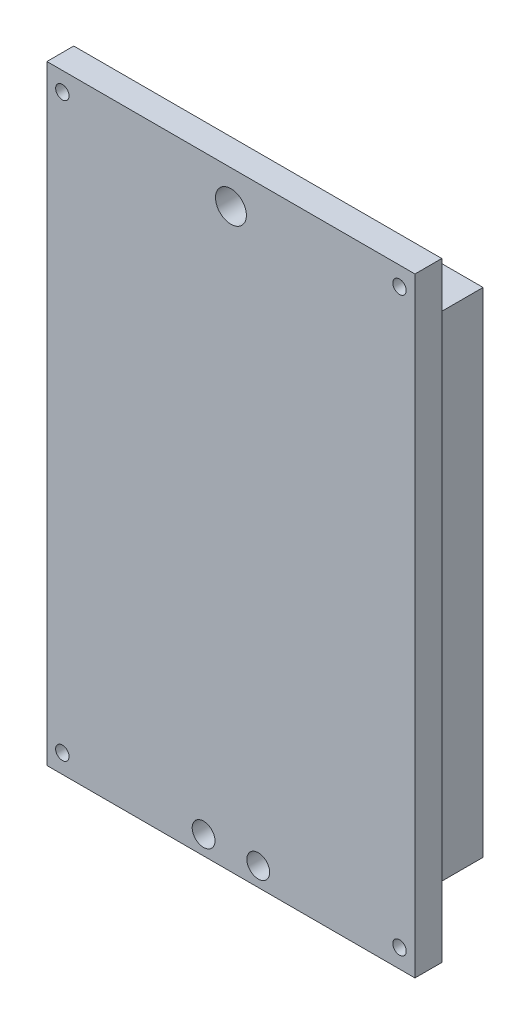
ISO-10303-21;
HEADER;
FILE_DESCRIPTION(('STEP AP214'),'2;1');
FILE_NAME('part.step','',(''),(''),'','','');
FILE_SCHEMA(('AUTOMOTIVE_DESIGN { 1 0 10303 214 1 1 1 1 }'));
ENDSEC;
DATA;
#1=APPLICATION_CONTEXT('core data for automotive mechanical design processes');
#2=APPLICATION_PROTOCOL_DEFINITION('international standard','automotive_design',2000,#1);
#3=PRODUCT_CONTEXT('',#1,'mechanical');
#4=PRODUCT('Part','Part','',(#3));
#5=PRODUCT_RELATED_PRODUCT_CATEGORY('part','',(#4));
#6=PRODUCT_DEFINITION_FORMATION('','',#4);
#7=PRODUCT_DEFINITION_CONTEXT('part definition',#1,'design');
#8=PRODUCT_DEFINITION('design','',#6,#7);
#9=PRODUCT_DEFINITION_SHAPE('','',#8);
#10=(LENGTH_UNIT() NAMED_UNIT(*) SI_UNIT(.MILLI.,.METRE.));
#11=(NAMED_UNIT(*) PLANE_ANGLE_UNIT() SI_UNIT($,.RADIAN.));
#12=(NAMED_UNIT(*) SI_UNIT($,.STERADIAN.) SOLID_ANGLE_UNIT());
#13=UNCERTAINTY_MEASURE_WITH_UNIT(LENGTH_MEASURE(1.E-05),#10,'distance_accuracy_value','');
#14=(GEOMETRIC_REPRESENTATION_CONTEXT(3) GLOBAL_UNCERTAINTY_ASSIGNED_CONTEXT((#13)) GLOBAL_UNIT_ASSIGNED_CONTEXT((#10,
#11,#12)) REPRESENTATION_CONTEXT('',''));
#15=CARTESIAN_POINT('',(0.,0.,0.));
#16=DIRECTION('',(0.,0.,1.));
#17=DIRECTION('',(1.,0.,0.));
#18=AXIS2_PLACEMENT_3D('',#15,#16,#17);
#19=CARTESIAN_POINT('',(0.,98.0600000011118,5.));
#20=DIRECTION('',(1.,0.,0.));
#21=DIRECTION('',(0.,1.,0.));
#22=AXIS2_PLACEMENT_3D('',#19,#20,#21);
#23=PLANE('',#22);
#24=DIRECTION('',(0.,-1.,0.));
#25=VECTOR('',#24,1.);
#26=CARTESIAN_POINT('',(0.,98.0600000011118,0.));
#27=LINE('',#26,#25);
#28=CARTESIAN_POINT('',(0.,98.0600000011118,0.));
#29=VERTEX_POINT('',#28);
#30=CARTESIAN_POINT('',(0.,-15.5899999988882,0.));
#31=VERTEX_POINT('',#30);
#32=EDGE_CURVE('E225',#29,#31,#27,.T.);
#33=ORIENTED_EDGE('',*,*,#32,.T.);
#34=DIRECTION('',(0.,0.,-1.));
#35=VECTOR('',#34,1.);
#36=CARTESIAN_POINT('',(0.,-15.5899999988882,5.));
#37=LINE('',#36,#35);
#38=CARTESIAN_POINT('',(0.,-15.5899999988882,5.));
#39=VERTEX_POINT('',#38);
#40=EDGE_CURVE('E11',#39,#31,#37,.T.);
#41=ORIENTED_EDGE('',*,*,#40,.F.);
#42=DIRECTION('',(0.,-1.,0.));
#43=VECTOR('',#42,1.);
#44=CARTESIAN_POINT('',(0.,98.0600000011118,5.));
#45=LINE('',#44,#43);
#46=CARTESIAN_POINT('',(0.,98.0600000011118,5.));
#47=VERTEX_POINT('',#46);
#48=EDGE_CURVE('E226',#47,#39,#45,.T.);
#49=ORIENTED_EDGE('',*,*,#48,.F.);
#50=DIRECTION('',(0.,0.,-1.));
#51=VECTOR('',#50,1.);
#52=CARTESIAN_POINT('',(0.,98.0600000011118,5.));
#53=LINE('',#52,#51);
#54=EDGE_CURVE('E236',#47,#29,#53,.T.);
#55=ORIENTED_EDGE('',*,*,#54,.T.);
#56=EDGE_LOOP('',(#33,#41,#49,#55));
#57=FACE_BOUND('',#56,.T.);
#58=ADVANCED_FACE('F38',(#57),#23,.F.);
#59=CARTESIAN_POINT('',(0.,-15.5899999988882,5.));
#60=DIRECTION('',(0.,1.,0.));
#61=DIRECTION('',(0.,0.,1.));
#62=AXIS2_PLACEMENT_3D('',#59,#60,#61);
#63=PLANE('',#62);
#64=DIRECTION('',(1.,0.,0.));
#65=VECTOR('',#64,1.);
#66=CARTESIAN_POINT('',(0.,-15.5899999988882,0.));
#67=LINE('',#66,#65);
#68=CARTESIAN_POINT('',(68.6000000011118,-15.5899999988882,0.));
#69=VERTEX_POINT('',#68);
#70=EDGE_CURVE('E239',#31,#69,#67,.T.);
#71=ORIENTED_EDGE('',*,*,#70,.T.);
#72=DIRECTION('',(0.,0.,-1.));
#73=VECTOR('',#72,1.);
#74=CARTESIAN_POINT('',(68.6000000011118,-15.5899999988882,5.));
#75=LINE('',#74,#73);
#76=CARTESIAN_POINT('',(68.6000000011118,-15.5899999988882,5.));
#77=VERTEX_POINT('',#76);
#78=EDGE_CURVE('E46',#77,#69,#75,.T.);
#79=ORIENTED_EDGE('',*,*,#78,.F.);
#80=DIRECTION('',(1.,0.,0.));
#81=VECTOR('',#80,1.);
#82=CARTESIAN_POINT('',(0.,-15.5899999988882,5.));
#83=LINE('',#82,#81);
#84=EDGE_CURVE('E229',#39,#77,#83,.T.);
#85=ORIENTED_EDGE('',*,*,#84,.F.);
#86=ORIENTED_EDGE('',*,*,#40,.T.);
#87=EDGE_LOOP('',(#71,#79,#85,#86));
#88=FACE_BOUND('',#87,.T.);
#89=ADVANCED_FACE('F304',(#88),#63,.F.);
#90=CARTESIAN_POINT('',(68.6000000011118,98.0600000011118,5.));
#91=DIRECTION('',(-1.,0.,0.));
#92=DIRECTION('',(0.,-1.,0.));
#93=AXIS2_PLACEMENT_3D('',#90,#91,#92);
#94=PLANE('',#93);
#95=DIRECTION('',(0.,1.,0.));
#96=VECTOR('',#95,1.);
#97=CARTESIAN_POINT('',(68.6000000011118,98.0600000011118,0.));
#98=LINE('',#97,#96);
#99=CARTESIAN_POINT('',(68.6000000011118,98.0600000011118,0.));
#100=VERTEX_POINT('',#99);
#101=EDGE_CURVE('E241',#69,#100,#98,.T.);
#102=ORIENTED_EDGE('',*,*,#101,.T.);
#103=DIRECTION('',(0.,0.,-1.));
#104=VECTOR('',#103,1.);
#105=CARTESIAN_POINT('',(68.6000000011118,98.0600000011118,5.));
#106=LINE('',#105,#104);
#107=CARTESIAN_POINT('',(68.6000000011118,98.0600000011118,5.));
#108=VERTEX_POINT('',#107);
#109=EDGE_CURVE('E246',#108,#100,#106,.T.);
#110=ORIENTED_EDGE('',*,*,#109,.F.);
#111=DIRECTION('',(0.,1.,0.));
#112=VECTOR('',#111,1.);
#113=CARTESIAN_POINT('',(68.6000000011118,98.0600000011118,5.));
#114=LINE('',#113,#112);
#115=EDGE_CURVE('E232',#77,#108,#114,.T.);
#116=ORIENTED_EDGE('',*,*,#115,.F.);
#117=ORIENTED_EDGE('',*,*,#78,.T.);
#118=EDGE_LOOP('',(#102,#110,#116,#117));
#119=FACE_BOUND('',#118,.T.);
#120=ADVANCED_FACE('F301',(#119),#94,.F.);
#121=CARTESIAN_POINT('',(0.,98.0600000011118,5.));
#122=DIRECTION('',(0.,-1.,0.));
#123=DIRECTION('',(0.,0.,-1.));
#124=AXIS2_PLACEMENT_3D('',#121,#122,#123);
#125=PLANE('',#124);
#126=DIRECTION('',(-1.,0.,0.));
#127=VECTOR('',#126,1.);
#128=CARTESIAN_POINT('',(0.,98.0600000011118,0.));
#129=LINE('',#128,#127);
#130=EDGE_CURVE('E230',#100,#29,#129,.T.);
#131=ORIENTED_EDGE('',*,*,#130,.T.);
#132=ORIENTED_EDGE('',*,*,#54,.F.);
#133=DIRECTION('',(-1.,0.,0.));
#134=VECTOR('',#133,1.);
#135=CARTESIAN_POINT('',(0.,98.0600000011118,5.));
#136=LINE('',#135,#134);
#137=EDGE_CURVE('E234',#108,#47,#136,.T.);
#138=ORIENTED_EDGE('',*,*,#137,.F.);
#139=ORIENTED_EDGE('',*,*,#109,.T.);
#140=EDGE_LOOP('',(#131,#132,#138,#139));
#141=FACE_BOUND('',#140,.T.);
#142=ADVANCED_FACE('F275',(#141),#125,.F.);
#143=CARTESIAN_POINT('',(0.,0.,0.));
#144=DIRECTION('',(0.,0.,1.));
#145=DIRECTION('',(1.,0.,0.));
#146=AXIS2_PLACEMENT_3D('',#143,#144,#145);
#147=PLANE('',#146);
#148=CARTESIAN_POINT('',(39.3974483505559,-12.0899999988882,0.));
#149=DIRECTION('',(0.,0.,-1.));
#150=DIRECTION('',(-1.,0.,0.));
#151=AXIS2_PLACEMENT_3D('',#148,#149,#150);
#152=CIRCLE('',#151,2.125);
#153=CARTESIAN_POINT('',(37.2724483505559,-12.0899999988882,0.));
#154=VERTEX_POINT('',#153);
#155=EDGE_CURVE('E255',#154,#154,#152,.T.);
#156=ORIENTED_EDGE('',*,*,#155,.F.);
#157=EDGE_LOOP('',(#156));
#158=FACE_BOUND('',#157,.T.);
#159=CARTESIAN_POINT('',(29.2025516505559,-12.0899999988882,0.));
#160=DIRECTION('',(0.,0.,-1.));
#161=DIRECTION('',(1.,0.,0.));
#162=AXIS2_PLACEMENT_3D('',#159,#160,#161);
#163=CIRCLE('',#162,2.125);
#164=CARTESIAN_POINT('',(31.3275516505559,-12.0899999988882,0.));
#165=VERTEX_POINT('',#164);
#166=EDGE_CURVE('E260',#165,#165,#163,.T.);
#167=ORIENTED_EDGE('',*,*,#166,.F.);
#168=EDGE_LOOP('',(#167));
#169=FACE_BOUND('',#168,.T.);
#170=CARTESIAN_POINT('',(34.3000000005559,91.8100318911118,0.));
#171=DIRECTION('',(0.,0.,-1.));
#172=DIRECTION('',(-1.,0.,0.));
#173=AXIS2_PLACEMENT_3D('',#170,#171,#172);
#174=CIRCLE('',#173,2.875);
#175=CARTESIAN_POINT('',(31.4250000005559,91.8100318911118,0.));
#176=VERTEX_POINT('',#175);
#177=EDGE_CURVE('E252',#176,#176,#174,.T.);
#178=ORIENTED_EDGE('',*,*,#177,.F.);
#179=EDGE_LOOP('',(#178));
#180=FACE_BOUND('',#179,.T.);
#181=DIRECTION('',(0.,-1.,0.));
#182=VECTOR('',#181,1.);
#183=CARTESIAN_POINT('',(2.30000000055591,-4.7649999988882,0.));
#184=LINE('',#183,#182);
#185=CARTESIAN_POINT('',(2.30000000055591,87.2350000011118,0.));
#186=VERTEX_POINT('',#185);
#187=CARTESIAN_POINT('',(2.30000000055591,-4.7649999988882,0.));
#188=VERTEX_POINT('',#187);
#189=EDGE_CURVE('E188',#186,#188,#184,.T.);
#190=ORIENTED_EDGE('',*,*,#189,.T.);
#191=DIRECTION('',(1.,0.,0.));
#192=VECTOR('',#191,1.);
#193=CARTESIAN_POINT('',(2.30000000055591,-4.7649999988882,0.));
#194=LINE('',#193,#192);
#195=CARTESIAN_POINT('',(66.3000000005559,-4.7649999988882,0.));
#196=VERTEX_POINT('',#195);
#197=EDGE_CURVE('E137',#188,#196,#194,.T.);
#198=ORIENTED_EDGE('',*,*,#197,.T.);
#199=DIRECTION('',(0.,1.,0.));
#200=VECTOR('',#199,1.);
#201=CARTESIAN_POINT('',(66.3000000005559,-4.7649999988882,0.));
#202=LINE('',#201,#200);
#203=CARTESIAN_POINT('',(66.3000000005559,87.2350000011118,0.));
#204=VERTEX_POINT('',#203);
#205=EDGE_CURVE('E176',#196,#204,#202,.T.);
#206=ORIENTED_EDGE('',*,*,#205,.T.);
#207=DIRECTION('',(-1.,0.,0.));
#208=VECTOR('',#207,1.);
#209=CARTESIAN_POINT('',(2.30000000055591,87.2350000011118,0.));
#210=LINE('',#209,#208);
#211=EDGE_CURVE('E54',#204,#186,#210,.T.);
#212=ORIENTED_EDGE('',*,*,#211,.T.);
#213=EDGE_LOOP('',(#190,#198,#206,#212));
#214=FACE_BOUND('',#213,.T.);
#215=CARTESIAN_POINT('',(2.87500000055592,-12.0899999988882,0.));
#216=DIRECTION('',(0.,0.,1.));
#217=DIRECTION('',(-1.,0.,0.));
#218=AXIS2_PLACEMENT_3D('',#215,#216,#217);
#219=CIRCLE('',#218,1.25);
#220=CARTESIAN_POINT('',(1.62500000055592,-12.0899999988882,0.));
#221=VERTEX_POINT('',#220);
#222=EDGE_CURVE('E201',#221,#221,#219,.T.);
#223=ORIENTED_EDGE('',*,*,#222,.T.);
#224=EDGE_LOOP('',(#223));
#225=FACE_BOUND('',#224,.T.);
#226=CARTESIAN_POINT('',(65.7250000005559,-12.0899999988882,0.));
#227=DIRECTION('',(0.,0.,1.));
#228=DIRECTION('',(1.,0.,0.));
#229=AXIS2_PLACEMENT_3D('',#226,#227,#228);
#230=CIRCLE('',#229,1.25);
#231=CARTESIAN_POINT('',(66.9750000005559,-12.0899999988882,0.));
#232=VERTEX_POINT('',#231);
#233=EDGE_CURVE('E206',#232,#232,#230,.T.);
#234=ORIENTED_EDGE('',*,*,#233,.T.);
#235=EDGE_LOOP('',(#234));
#236=FACE_BOUND('',#235,.T.);
#237=CARTESIAN_POINT('',(65.7250000005559,94.5600000011118,0.));
#238=DIRECTION('',(0.,0.,1.));
#239=DIRECTION('',(-1.,0.,0.));
#240=AXIS2_PLACEMENT_3D('',#237,#238,#239);
#241=CIRCLE('',#240,1.25);
#242=CARTESIAN_POINT('',(64.4750000005559,94.5600000011118,0.));
#243=VERTEX_POINT('',#242);
#244=EDGE_CURVE('E202',#243,#243,#241,.T.);
#245=ORIENTED_EDGE('',*,*,#244,.T.);
#246=EDGE_LOOP('',(#245));
#247=FACE_BOUND('',#246,.T.);
#248=CARTESIAN_POINT('',(2.87500000055592,94.5600000011118,0.));
#249=DIRECTION('',(0.,0.,1.));
#250=DIRECTION('',(1.,0.,0.));
#251=AXIS2_PLACEMENT_3D('',#248,#249,#250);
#252=CIRCLE('',#251,1.25);
#253=CARTESIAN_POINT('',(4.12500000055592,94.5600000011118,0.));
#254=VERTEX_POINT('',#253);
#255=EDGE_CURVE('E205',#254,#254,#252,.T.);
#256=ORIENTED_EDGE('',*,*,#255,.T.);
#257=EDGE_LOOP('',(#256));
#258=FACE_BOUND('',#257,.T.);
#259=ORIENTED_EDGE('',*,*,#32,.F.);
#260=ORIENTED_EDGE('',*,*,#130,.F.);
#261=ORIENTED_EDGE('',*,*,#101,.F.);
#262=ORIENTED_EDGE('',*,*,#70,.F.);
#263=EDGE_LOOP('',(#259,#260,#261,#262));
#264=FACE_BOUND('',#263,.T.);
#265=ADVANCED_FACE('F271',(#158,#169,#180,#214,#225,#236,#247,#258,#264),#147,.F.);
#266=CARTESIAN_POINT('',(2.87500000055592,94.5600000011118,24.));
#267=DIRECTION('',(0.,0.,-1.));
#268=DIRECTION('',(-1.,0.,0.));
#269=AXIS2_PLACEMENT_3D('',#266,#267,#268);
#270=CYLINDRICAL_SURFACE('',#269,1.25);
#271=CARTESIAN_POINT('',(2.87500000055592,94.5600000011118,5.));
#272=DIRECTION('',(0.,0.,1.));
#273=DIRECTION('',(1.,0.,0.));
#274=AXIS2_PLACEMENT_3D('',#271,#272,#273);
#275=CIRCLE('',#274,1.25);
#276=CARTESIAN_POINT('',(4.12500000055592,94.5600000011118,5.));
#277=VERTEX_POINT('',#276);
#278=EDGE_CURVE('E213',#277,#277,#275,.F.);
#279=ORIENTED_EDGE('',*,*,#278,.F.);
#280=EDGE_LOOP('',(#279));
#281=FACE_BOUND('',#280,.T.);
#282=ORIENTED_EDGE('',*,*,#255,.F.);
#283=EDGE_LOOP('',(#282));
#284=FACE_BOUND('',#283,.T.);
#285=ADVANCED_FACE('F274',(#281,#284),#270,.F.);
#286=CARTESIAN_POINT('',(65.7250000005559,94.5600000011118,24.));
#287=DIRECTION('',(0.,0.,-1.));
#288=DIRECTION('',(-1.,0.,0.));
#289=AXIS2_PLACEMENT_3D('',#286,#287,#288);
#290=CYLINDRICAL_SURFACE('',#289,1.25);
#291=CARTESIAN_POINT('',(65.7250000005559,94.5600000011118,5.));
#292=DIRECTION('',(0.,0.,1.));
#293=DIRECTION('',(1.,0.,0.));
#294=AXIS2_PLACEMENT_3D('',#291,#292,#293);
#295=CIRCLE('',#294,1.25);
#296=CARTESIAN_POINT('',(66.9750000005559,94.5600000011118,5.));
#297=VERTEX_POINT('',#296);
#298=EDGE_CURVE('E216',#297,#297,#295,.F.);
#299=ORIENTED_EDGE('',*,*,#298,.F.);
#300=EDGE_LOOP('',(#299));
#301=FACE_BOUND('',#300,.T.);
#302=ORIENTED_EDGE('',*,*,#244,.F.);
#303=EDGE_LOOP('',(#302));
#304=FACE_BOUND('',#303,.T.);
#305=ADVANCED_FACE('F315',(#301,#304),#290,.F.);
#306=CARTESIAN_POINT('',(65.7250000005559,-12.0899999988882,24.));
#307=DIRECTION('',(0.,0.,-1.));
#308=DIRECTION('',(-1.,0.,0.));
#309=AXIS2_PLACEMENT_3D('',#306,#307,#308);
#310=CYLINDRICAL_SURFACE('',#309,1.25);
#311=CARTESIAN_POINT('',(65.7250000005559,-12.0899999988882,5.));
#312=DIRECTION('',(0.,0.,1.));
#313=DIRECTION('',(1.,0.,0.));
#314=AXIS2_PLACEMENT_3D('',#311,#312,#313);
#315=CIRCLE('',#314,1.25);
#316=CARTESIAN_POINT('',(66.9750000005559,-12.0899999988882,5.));
#317=VERTEX_POINT('',#316);
#318=EDGE_CURVE('E219',#317,#317,#315,.F.);
#319=ORIENTED_EDGE('',*,*,#318,.F.);
#320=EDGE_LOOP('',(#319));
#321=FACE_BOUND('',#320,.T.);
#322=ORIENTED_EDGE('',*,*,#233,.F.);
#323=EDGE_LOOP('',(#322));
#324=FACE_BOUND('',#323,.T.);
#325=ADVANCED_FACE('F318',(#321,#324),#310,.F.);
#326=CARTESIAN_POINT('',(2.87500000055592,-12.0899999988882,24.));
#327=DIRECTION('',(0.,0.,-1.));
#328=DIRECTION('',(-1.,0.,0.));
#329=AXIS2_PLACEMENT_3D('',#326,#327,#328);
#330=CYLINDRICAL_SURFACE('',#329,1.25);
#331=CARTESIAN_POINT('',(2.87500000055592,-12.0899999988882,5.));
#332=DIRECTION('',(0.,0.,1.));
#333=DIRECTION('',(1.,0.,0.));
#334=AXIS2_PLACEMENT_3D('',#331,#332,#333);
#335=CIRCLE('',#334,1.25);
#336=CARTESIAN_POINT('',(4.12500000055592,-12.0899999988882,5.));
#337=VERTEX_POINT('',#336);
#338=EDGE_CURVE('E222',#337,#337,#335,.F.);
#339=ORIENTED_EDGE('',*,*,#338,.F.);
#340=EDGE_LOOP('',(#339));
#341=FACE_BOUND('',#340,.T.);
#342=ORIENTED_EDGE('',*,*,#222,.F.);
#343=EDGE_LOOP('',(#342));
#344=FACE_BOUND('',#343,.T.);
#345=ADVANCED_FACE('F324',(#341,#344),#330,.F.);
#346=CARTESIAN_POINT('',(2.30000000055591,-4.7649999988882,-10.));
#347=DIRECTION('',(0.,-1.,0.));
#348=DIRECTION('',(0.,0.,-1.));
#349=AXIS2_PLACEMENT_3D('',#346,#347,#348);
#350=PLANE('',#349);
#351=ORIENTED_EDGE('',*,*,#197,.F.);
#352=DIRECTION('',(0.,0.,1.));
#353=VECTOR('',#352,1.);
#354=CARTESIAN_POINT('',(2.30000000055591,-4.7649999988882,-10.));
#355=LINE('',#354,#353);
#356=CARTESIAN_POINT('',(2.30000000055591,-4.7649999988882,-10.));
#357=VERTEX_POINT('',#356);
#358=EDGE_CURVE('E199',#357,#188,#355,.T.);
#359=ORIENTED_EDGE('',*,*,#358,.F.);
#360=DIRECTION('',(1.,0.,0.));
#361=VECTOR('',#360,1.);
#362=CARTESIAN_POINT('',(2.30000000055591,-4.7649999988882,-10.));
#363=LINE('',#362,#361);
#364=CARTESIAN_POINT('',(66.3000000005559,-4.7649999988882,-10.));
#365=VERTEX_POINT('',#364);
#366=EDGE_CURVE('E172',#357,#365,#363,.T.);
#367=ORIENTED_EDGE('',*,*,#366,.T.);
#368=DIRECTION('',(0.,0.,1.));
#369=VECTOR('',#368,1.);
#370=CARTESIAN_POINT('',(66.3000000005559,-4.7649999988882,-10.));
#371=LINE('',#370,#369);
#372=EDGE_CURVE('E185',#365,#196,#371,.T.);
#373=ORIENTED_EDGE('',*,*,#372,.T.);
#374=EDGE_LOOP('',(#351,#359,#367,#373));
#375=FACE_BOUND('',#374,.T.);
#376=ADVANCED_FACE('F342',(#375),#350,.T.);
#377=CARTESIAN_POINT('',(2.30000000055591,-4.7649999988882,-10.));
#378=DIRECTION('',(-1.,0.,0.));
#379=DIRECTION('',(0.,0.,1.));
#380=AXIS2_PLACEMENT_3D('',#377,#378,#379);
#381=PLANE('',#380);
#382=ORIENTED_EDGE('',*,*,#189,.F.);
#383=DIRECTION('',(0.,0.,1.));
#384=VECTOR('',#383,1.);
#385=CARTESIAN_POINT('',(2.30000000055591,87.2350000011118,-10.));
#386=LINE('',#385,#384);
#387=CARTESIAN_POINT('',(2.30000000055591,87.2350000011118,-10.));
#388=VERTEX_POINT('',#387);
#389=EDGE_CURVE('E197',#388,#186,#386,.T.);
#390=ORIENTED_EDGE('',*,*,#389,.F.);
#391=DIRECTION('',(0.,-1.,0.));
#392=VECTOR('',#391,1.);
#393=CARTESIAN_POINT('',(2.30000000055591,-4.7649999988882,-10.));
#394=LINE('',#393,#392);
#395=EDGE_CURVE('E175',#388,#357,#394,.T.);
#396=ORIENTED_EDGE('',*,*,#395,.T.);
#397=ORIENTED_EDGE('',*,*,#358,.T.);
#398=EDGE_LOOP('',(#382,#390,#396,#397));
#399=FACE_BOUND('',#398,.T.);
#400=ADVANCED_FACE('F347',(#399),#381,.T.);
#401=CARTESIAN_POINT('',(2.30000000055591,87.2350000011118,-10.));
#402=DIRECTION('',(0.,1.,0.));
#403=DIRECTION('',(0.,0.,1.));
#404=AXIS2_PLACEMENT_3D('',#401,#402,#403);
#405=PLANE('',#404);
#406=ORIENTED_EDGE('',*,*,#211,.F.);
#407=DIRECTION('',(0.,0.,1.));
#408=VECTOR('',#407,1.);
#409=CARTESIAN_POINT('',(66.3000000005559,87.2350000011118,-10.));
#410=LINE('',#409,#408);
#411=CARTESIAN_POINT('',(66.3000000005559,87.2350000011118,-10.));
#412=VERTEX_POINT('',#411);
#413=EDGE_CURVE('E195',#412,#204,#410,.T.);
#414=ORIENTED_EDGE('',*,*,#413,.F.);
#415=DIRECTION('',(-1.,0.,0.));
#416=VECTOR('',#415,1.);
#417=CARTESIAN_POINT('',(2.30000000055591,87.2350000011118,-10.));
#418=LINE('',#417,#416);
#419=EDGE_CURVE('E179',#412,#388,#418,.T.);
#420=ORIENTED_EDGE('',*,*,#419,.T.);
#421=ORIENTED_EDGE('',*,*,#389,.T.);
#422=EDGE_LOOP('',(#406,#414,#420,#421));
#423=FACE_BOUND('',#422,.T.);
#424=ADVANCED_FACE('F355',(#423),#405,.T.);
#425=CARTESIAN_POINT('',(66.3000000005559,-4.7649999988882,-10.));
#426=DIRECTION('',(1.,0.,0.));
#427=DIRECTION('',(0.,0.,-1.));
#428=AXIS2_PLACEMENT_3D('',#425,#426,#427);
#429=PLANE('',#428);
#430=ORIENTED_EDGE('',*,*,#205,.F.);
#431=ORIENTED_EDGE('',*,*,#372,.F.);
#432=DIRECTION('',(0.,1.,0.));
#433=VECTOR('',#432,1.);
#434=CARTESIAN_POINT('',(66.3000000005559,-4.7649999988882,-10.));
#435=LINE('',#434,#433);
#436=EDGE_CURVE('E182',#365,#412,#435,.T.);
#437=ORIENTED_EDGE('',*,*,#436,.T.);
#438=ORIENTED_EDGE('',*,*,#413,.T.);
#439=EDGE_LOOP('',(#430,#431,#437,#438));
#440=FACE_BOUND('',#439,.T.);
#441=ADVANCED_FACE('F362',(#440),#429,.T.);
#442=CARTESIAN_POINT('',(0.,0.,-10.));
#443=DIRECTION('',(0.,0.,-1.));
#444=DIRECTION('',(1.,0.,0.));
#445=AXIS2_PLACEMENT_3D('',#442,#443,#444);
#446=PLANE('',#445);
#447=DIRECTION('',(0.,1.,0.));
#448=VECTOR('',#447,1.);
#449=CARTESIAN_POINT('',(63.3000000005559,-1.7649999988882,-10.));
#450=LINE('',#449,#448);
#451=CARTESIAN_POINT('',(63.3000000005559,-1.7649999988882,-10.));
#452=VERTEX_POINT('',#451);
#453=CARTESIAN_POINT('',(63.3000000005559,84.2350000011118,-10.));
#454=VERTEX_POINT('',#453);
#455=EDGE_CURVE('E141',#452,#454,#450,.T.);
#456=ORIENTED_EDGE('',*,*,#455,.T.);
#457=DIRECTION('',(-1.,0.,0.));
#458=VECTOR('',#457,1.);
#459=CARTESIAN_POINT('',(5.30000000055591,84.2350000011118,-10.));
#460=LINE('',#459,#458);
#461=CARTESIAN_POINT('',(5.30000000055591,84.2350000011118,-10.));
#462=VERTEX_POINT('',#461);
#463=EDGE_CURVE('E154',#454,#462,#460,.T.);
#464=ORIENTED_EDGE('',*,*,#463,.T.);
#465=DIRECTION('',(0.,-1.,0.));
#466=VECTOR('',#465,1.);
#467=CARTESIAN_POINT('',(5.30000000055591,-1.7649999988882,-10.));
#468=LINE('',#467,#466);
#469=CARTESIAN_POINT('',(5.30000000055591,-1.7649999988882,-10.));
#470=VERTEX_POINT('',#469);
#471=EDGE_CURVE('E152',#462,#470,#468,.T.);
#472=ORIENTED_EDGE('',*,*,#471,.T.);
#473=DIRECTION('',(1.,0.,0.));
#474=VECTOR('',#473,1.);
#475=CARTESIAN_POINT('',(5.30000000055591,-1.7649999988882,-10.));
#476=LINE('',#475,#474);
#477=EDGE_CURVE('E133',#470,#452,#476,.T.);
#478=ORIENTED_EDGE('',*,*,#477,.T.);
#479=EDGE_LOOP('',(#456,#464,#472,#478));
#480=FACE_BOUND('',#479,.T.);
#481=ORIENTED_EDGE('',*,*,#366,.F.);
#482=ORIENTED_EDGE('',*,*,#395,.F.);
#483=ORIENTED_EDGE('',*,*,#419,.F.);
#484=ORIENTED_EDGE('',*,*,#436,.F.);
#485=EDGE_LOOP('',(#481,#482,#483,#484));
#486=FACE_BOUND('',#485,.T.);
#487=ADVANCED_FACE('F150',(#480,#486),#446,.T.);
#488=CARTESIAN_POINT('',(63.3000000005559,-1.7649999988882,-10.));
#489=DIRECTION('',(1.,0.,0.));
#490=DIRECTION('',(0.,0.,-1.));
#491=AXIS2_PLACEMENT_3D('',#488,#489,#490);
#492=PLANE('',#491);
#493=DIRECTION('',(0.,1.,0.));
#494=VECTOR('',#493,1.);
#495=CARTESIAN_POINT('',(63.3000000005559,-1.7649999988882,0.));
#496=LINE('',#495,#494);
#497=CARTESIAN_POINT('',(63.3000000005559,-1.7649999988882,0.));
#498=VERTEX_POINT('',#497);
#499=CARTESIAN_POINT('',(63.3000000005559,84.2350000011118,0.));
#500=VERTEX_POINT('',#499);
#501=EDGE_CURVE('E62',#498,#500,#496,.T.);
#502=ORIENTED_EDGE('',*,*,#501,.T.);
#503=DIRECTION('',(0.,0.,1.));
#504=VECTOR('',#503,1.);
#505=CARTESIAN_POINT('',(63.3000000005559,84.2350000011118,-10.));
#506=LINE('',#505,#504);
#507=EDGE_CURVE('E144',#454,#500,#506,.T.);
#508=ORIENTED_EDGE('',*,*,#507,.F.);
#509=ORIENTED_EDGE('',*,*,#455,.F.);
#510=DIRECTION('',(0.,0.,1.));
#511=VECTOR('',#510,1.);
#512=CARTESIAN_POINT('',(63.3000000005559,-1.7649999988882,-10.));
#513=LINE('',#512,#511);
#514=EDGE_CURVE('E128',#452,#498,#513,.T.);
#515=ORIENTED_EDGE('',*,*,#514,.T.);
#516=EDGE_LOOP('',(#502,#508,#509,#515));
#517=FACE_BOUND('',#516,.T.);
#518=ADVANCED_FACE('F142',(#517),#492,.F.);
#519=CARTESIAN_POINT('',(5.30000000055591,-1.7649999988882,-10.));
#520=DIRECTION('',(0.,-1.,0.));
#521=DIRECTION('',(0.,0.,-1.));
#522=AXIS2_PLACEMENT_3D('',#519,#520,#521);
#523=PLANE('',#522);
#524=DIRECTION('',(1.,0.,0.));
#525=VECTOR('',#524,1.);
#526=CARTESIAN_POINT('',(5.30000000055591,-1.7649999988882,0.));
#527=LINE('',#526,#525);
#528=CARTESIAN_POINT('',(5.30000000055591,-1.7649999988882,0.));
#529=VERTEX_POINT('',#528);
#530=EDGE_CURVE('E135',#529,#498,#527,.T.);
#531=ORIENTED_EDGE('',*,*,#530,.T.);
#532=ORIENTED_EDGE('',*,*,#514,.F.);
#533=ORIENTED_EDGE('',*,*,#477,.F.);
#534=DIRECTION('',(0.,0.,1.));
#535=VECTOR('',#534,1.);
#536=CARTESIAN_POINT('',(5.30000000055591,-1.7649999988882,-10.));
#537=LINE('',#536,#535);
#538=EDGE_CURVE('E138',#470,#529,#537,.T.);
#539=ORIENTED_EDGE('',*,*,#538,.T.);
#540=EDGE_LOOP('',(#531,#532,#533,#539));
#541=FACE_BOUND('',#540,.T.);
#542=ADVANCED_FACE('F130',(#541),#523,.F.);
#543=CARTESIAN_POINT('',(5.30000000055591,-1.7649999988882,-10.));
#544=DIRECTION('',(-1.,0.,0.));
#545=DIRECTION('',(0.,0.,1.));
#546=AXIS2_PLACEMENT_3D('',#543,#544,#545);
#547=PLANE('',#546);
#548=DIRECTION('',(0.,-1.,0.));
#549=VECTOR('',#548,1.);
#550=CARTESIAN_POINT('',(5.30000000055591,-1.7649999988882,0.));
#551=LINE('',#550,#549);
#552=CARTESIAN_POINT('',(5.30000000055591,84.2350000011118,0.));
#553=VERTEX_POINT('',#552);
#554=EDGE_CURVE('E162',#553,#529,#551,.T.);
#555=ORIENTED_EDGE('',*,*,#554,.T.);
#556=ORIENTED_EDGE('',*,*,#538,.F.);
#557=ORIENTED_EDGE('',*,*,#471,.F.);
#558=DIRECTION('',(0.,0.,1.));
#559=VECTOR('',#558,1.);
#560=CARTESIAN_POINT('',(5.30000000055591,84.2350000011118,-10.));
#561=LINE('',#560,#559);
#562=EDGE_CURVE('E168',#462,#553,#561,.T.);
#563=ORIENTED_EDGE('',*,*,#562,.T.);
#564=EDGE_LOOP('',(#555,#556,#557,#563));
#565=FACE_BOUND('',#564,.T.);
#566=ADVANCED_FACE('F372',(#565),#547,.F.);
#567=CARTESIAN_POINT('',(5.30000000055591,84.2350000011118,-10.));
#568=DIRECTION('',(0.,1.,0.));
#569=DIRECTION('',(0.,0.,1.));
#570=AXIS2_PLACEMENT_3D('',#567,#568,#569);
#571=PLANE('',#570);
#572=DIRECTION('',(-1.,0.,0.));
#573=VECTOR('',#572,1.);
#574=CARTESIAN_POINT('',(5.30000000055591,84.2350000011118,0.));
#575=LINE('',#574,#573);
#576=EDGE_CURVE('E148',#500,#553,#575,.T.);
#577=ORIENTED_EDGE('',*,*,#576,.T.);
#578=ORIENTED_EDGE('',*,*,#562,.F.);
#579=ORIENTED_EDGE('',*,*,#463,.F.);
#580=ORIENTED_EDGE('',*,*,#507,.T.);
#581=EDGE_LOOP('',(#577,#578,#579,#580));
#582=FACE_BOUND('',#581,.T.);
#583=ADVANCED_FACE('F375',(#582),#571,.F.);
#584=ORIENTED_EDGE('',*,*,#501,.F.);
#585=ORIENTED_EDGE('',*,*,#530,.F.);
#586=ORIENTED_EDGE('',*,*,#554,.F.);
#587=ORIENTED_EDGE('',*,*,#576,.F.);
#588=EDGE_LOOP('',(#584,#585,#586,#587));
#589=FACE_BOUND('',#588,.T.);
#590=ADVANCED_FACE('F278',(#589),#147,.F.);
#591=CARTESIAN_POINT('',(0.,0.,5.));
#592=DIRECTION('',(0.,0.,1.));
#593=DIRECTION('',(1.,0.,0.));
#594=AXIS2_PLACEMENT_3D('',#591,#592,#593);
#595=PLANE('',#594);
#596=CARTESIAN_POINT('',(39.3974483505559,-12.0899999988882,5.));
#597=DIRECTION('',(0.,0.,1.));
#598=DIRECTION('',(1.,0.,0.));
#599=AXIS2_PLACEMENT_3D('',#596,#597,#598);
#600=CIRCLE('',#599,2.125);
#601=CARTESIAN_POINT('',(41.5224483505559,-12.0899999988882,5.));
#602=VERTEX_POINT('',#601);
#603=EDGE_CURVE('E41',#602,#602,#600,.T.);
#604=ORIENTED_EDGE('',*,*,#603,.F.);
#605=EDGE_LOOP('',(#604));
#606=FACE_BOUND('',#605,.T.);
#607=CARTESIAN_POINT('',(29.2025516505559,-12.0899999988882,5.));
#608=DIRECTION('',(0.,0.,1.));
#609=DIRECTION('',(1.,0.,0.));
#610=AXIS2_PLACEMENT_3D('',#607,#608,#609);
#611=CIRCLE('',#610,2.125);
#612=CARTESIAN_POINT('',(31.3275516505559,-12.0899999988882,5.));
#613=VERTEX_POINT('',#612);
#614=EDGE_CURVE('E253',#613,#613,#611,.T.);
#615=ORIENTED_EDGE('',*,*,#614,.F.);
#616=EDGE_LOOP('',(#615));
#617=FACE_BOUND('',#616,.T.);
#618=CARTESIAN_POINT('',(34.3000000005559,91.8100318911118,5.));
#619=DIRECTION('',(0.,0.,1.));
#620=DIRECTION('',(1.,0.,0.));
#621=AXIS2_PLACEMENT_3D('',#618,#619,#620);
#622=CIRCLE('',#621,2.875);
#623=CARTESIAN_POINT('',(37.1750000005559,91.8100318911118,5.));
#624=VERTEX_POINT('',#623);
#625=EDGE_CURVE('E160',#624,#624,#622,.T.);
#626=ORIENTED_EDGE('',*,*,#625,.F.);
#627=EDGE_LOOP('',(#626));
#628=FACE_BOUND('',#627,.T.);
#629=ORIENTED_EDGE('',*,*,#318,.T.);
#630=EDGE_LOOP('',(#629));
#631=FACE_BOUND('',#630,.T.);
#632=ORIENTED_EDGE('',*,*,#338,.T.);
#633=EDGE_LOOP('',(#632));
#634=FACE_BOUND('',#633,.T.);
#635=ORIENTED_EDGE('',*,*,#84,.T.);
#636=ORIENTED_EDGE('',*,*,#115,.T.);
#637=ORIENTED_EDGE('',*,*,#137,.T.);
#638=ORIENTED_EDGE('',*,*,#48,.T.);
#639=EDGE_LOOP('',(#635,#636,#637,#638));
#640=FACE_BOUND('',#639,.T.);
#641=ORIENTED_EDGE('',*,*,#278,.T.);
#642=EDGE_LOOP('',(#641));
#643=FACE_BOUND('',#642,.T.);
#644=ORIENTED_EDGE('',*,*,#298,.T.);
#645=EDGE_LOOP('',(#644));
#646=FACE_BOUND('',#645,.T.);
#647=ADVANCED_FACE('F306',(#606,#617,#628,#631,#634,#640,#643,#646),#595,.T.);
#648=CARTESIAN_POINT('',(34.3000000005559,91.8100318911118,10.));
#649=DIRECTION('',(0.,0.,-1.));
#650=DIRECTION('',(-1.,0.,0.));
#651=AXIS2_PLACEMENT_3D('',#648,#649,#650);
#652=CYLINDRICAL_SURFACE('',#651,2.875);
#653=ORIENTED_EDGE('',*,*,#625,.T.);
#654=EDGE_LOOP('',(#653));
#655=FACE_BOUND('',#654,.T.);
#656=ORIENTED_EDGE('',*,*,#177,.T.);
#657=EDGE_LOOP('',(#656));
#658=FACE_BOUND('',#657,.T.);
#659=ADVANCED_FACE('F269',(#655,#658),#652,.F.);
#660=CARTESIAN_POINT('',(29.2025516505559,-12.0899999988882,10.));
#661=DIRECTION('',(0.,0.,-1.));
#662=DIRECTION('',(-1.,0.,0.));
#663=AXIS2_PLACEMENT_3D('',#660,#661,#662);
#664=CYLINDRICAL_SURFACE('',#663,2.125);
#665=ORIENTED_EDGE('',*,*,#614,.T.);
#666=EDGE_LOOP('',(#665));
#667=FACE_BOUND('',#666,.T.);
#668=ORIENTED_EDGE('',*,*,#166,.T.);
#669=EDGE_LOOP('',(#668));
#670=FACE_BOUND('',#669,.T.);
#671=ADVANCED_FACE('F382',(#667,#670),#664,.F.);
#672=CARTESIAN_POINT('',(39.3974483505559,-12.0899999988882,10.));
#673=DIRECTION('',(0.,0.,-1.));
#674=DIRECTION('',(-1.,0.,0.));
#675=AXIS2_PLACEMENT_3D('',#672,#673,#674);
#676=CYLINDRICAL_SURFACE('',#675,2.125);
#677=ORIENTED_EDGE('',*,*,#603,.T.);
#678=EDGE_LOOP('',(#677));
#679=FACE_BOUND('',#678,.T.);
#680=ORIENTED_EDGE('',*,*,#155,.T.);
#681=EDGE_LOOP('',(#680));
#682=FACE_BOUND('',#681,.T.);
#683=ADVANCED_FACE('F386',(#679,#682),#676,.F.);
#684=CLOSED_SHELL('',(#58,#89,#120,#142,#265,#285,#305,#325,#345,#376,#400,#424,#441,#487,#518,
#542,#566,#583,#590,#647,#659,#671,#683));
#685=MANIFOLD_SOLID_BREP('B2',#684);
#686=ADVANCED_BREP_SHAPE_REPRESENTATION('',(#18,#685),#14);
#687=SHAPE_DEFINITION_REPRESENTATION(#9,#686);
ENDSEC;
END-ISO-10303-21;
